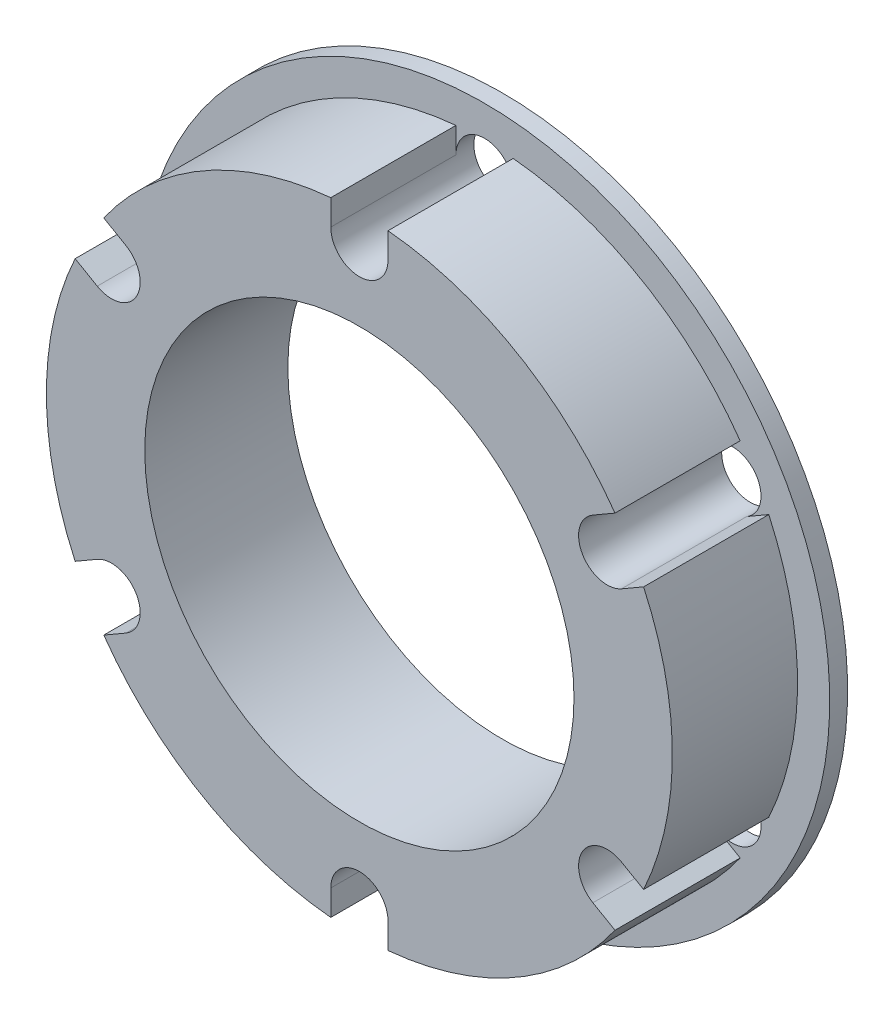
ISO-10303-21;
HEADER;
FILE_DESCRIPTION(('STEP AP214'),'2;1');
FILE_NAME('part.step','',(''),(''),'','','');
FILE_SCHEMA(('AUTOMOTIVE_DESIGN { 1 0 10303 214 1 1 1 1 }'));
ENDSEC;
DATA;
#1=APPLICATION_CONTEXT('core data for automotive mechanical design processes');
#2=APPLICATION_PROTOCOL_DEFINITION('international standard','automotive_design',2000,#1);
#3=PRODUCT_CONTEXT('',#1,'mechanical');
#4=PRODUCT('Part','Part','',(#3));
#5=PRODUCT_RELATED_PRODUCT_CATEGORY('part','',(#4));
#6=PRODUCT_DEFINITION_FORMATION('','',#4);
#7=PRODUCT_DEFINITION_CONTEXT('part definition',#1,'design');
#8=PRODUCT_DEFINITION('design','',#6,#7);
#9=PRODUCT_DEFINITION_SHAPE('','',#8);
#10=(LENGTH_UNIT() NAMED_UNIT(*) SI_UNIT(.MILLI.,.METRE.));
#11=(NAMED_UNIT(*) PLANE_ANGLE_UNIT() SI_UNIT($,.RADIAN.));
#12=(NAMED_UNIT(*) SI_UNIT($,.STERADIAN.) SOLID_ANGLE_UNIT());
#13=UNCERTAINTY_MEASURE_WITH_UNIT(LENGTH_MEASURE(1.E-05),#10,'distance_accuracy_value','');
#14=(GEOMETRIC_REPRESENTATION_CONTEXT(3) GLOBAL_UNCERTAINTY_ASSIGNED_CONTEXT((#13)) GLOBAL_UNIT_ASSIGNED_CONTEXT((#10,
#11,#12)) REPRESENTATION_CONTEXT('',''));
#15=CARTESIAN_POINT('',(0.,0.,0.));
#16=DIRECTION('',(0.,0.,1.));
#17=DIRECTION('',(1.,0.,0.));
#18=AXIS2_PLACEMENT_3D('',#15,#16,#17);
#19=CARTESIAN_POINT('',(0.,0.,-14.9097874185233));
#20=DIRECTION('',(0.,0.,-1.));
#21=DIRECTION('',(-1.,0.,0.));
#22=AXIS2_PLACEMENT_3D('',#19,#20,#21);
#23=CYLINDRICAL_SURFACE('',#22,17.5);
#24=DIRECTION('',(0.,0.,1.));
#25=VECTOR('',#24,1.);
#26=CARTESIAN_POINT('',(-1.6,17.4267036469896,-8.6865068641108));
#27=LINE('',#26,#25);
#28=CARTESIAN_POINT('',(-1.6,17.4267036469896,-3.5));
#29=VERTEX_POINT('',#28);
#30=CARTESIAN_POINT('',(-1.6,17.4267036469896,3.5));
#31=VERTEX_POINT('',#30);
#32=EDGE_CURVE('E220',#29,#31,#27,.T.);
#33=ORIENTED_EDGE('',*,*,#32,.F.);
#34=CARTESIAN_POINT('',(0.,0.,-3.5));
#35=DIRECTION('',(0.,0.,-1.));
#36=DIRECTION('',(-1.,0.,0.));
#37=AXIS2_PLACEMENT_3D('',#34,#35,#36);
#38=CIRCLE('',#37,17.5);
#39=CARTESIAN_POINT('',(-14.2919680625158,10.0989924695501,-3.5));
#40=VERTEX_POINT('',#39);
#41=EDGE_CURVE('E346',#40,#29,#38,.T.);
#42=ORIENTED_EDGE('',*,*,#41,.F.);
#43=DIRECTION('',(0.,0.,1.));
#44=VECTOR('',#43,1.);
#45=CARTESIAN_POINT('',(-14.2919680625158,10.0989924695501,-8.6865068641108));
#46=LINE('',#45,#44);
#47=CARTESIAN_POINT('',(-14.2919680625158,10.0989924695501,3.5));
#48=VERTEX_POINT('',#47);
#49=EDGE_CURVE('E241',#40,#48,#46,.T.);
#50=ORIENTED_EDGE('',*,*,#49,.T.);
#51=CARTESIAN_POINT('',(0.,0.,3.5));
#52=DIRECTION('',(0.,0.,-1.));
#53=DIRECTION('',(-1.,0.,0.));
#54=AXIS2_PLACEMENT_3D('',#51,#52,#53);
#55=CIRCLE('',#54,17.5);
#56=EDGE_CURVE('E341',#48,#31,#55,.T.);
#57=ORIENTED_EDGE('',*,*,#56,.T.);
#58=EDGE_LOOP('',(#33,#42,#50,#57));
#59=FACE_BOUND('',#58,.T.);
#60=ADVANCED_FACE('F33',(#59),#23,.T.);
#61=DIRECTION('',(0.,0.,1.));
#62=VECTOR('',#61,1.);
#63=CARTESIAN_POINT('',(-15.8919680625158,7.32771117743988,-8.6865068641108));
#64=LINE('',#63,#62);
#65=CARTESIAN_POINT('',(-15.8919680625158,7.32771117743988,-3.5));
#66=VERTEX_POINT('',#65);
#67=CARTESIAN_POINT('',(-15.8919680625158,7.32771117743988,3.5));
#68=VERTEX_POINT('',#67);
#69=EDGE_CURVE('E239',#66,#68,#64,.T.);
#70=ORIENTED_EDGE('',*,*,#69,.F.);
#71=CARTESIAN_POINT('',(-15.891968062516,-7.32771117743954,-3.5));
#72=VERTEX_POINT('',#71);
#73=EDGE_CURVE('E342',#72,#66,#38,.T.);
#74=ORIENTED_EDGE('',*,*,#73,.F.);
#75=DIRECTION('',(0.,0.,1.));
#76=VECTOR('',#75,1.);
#77=CARTESIAN_POINT('',(-15.891968062516,-7.32771117743954,-8.6865068641108));
#78=LINE('',#77,#76);
#79=CARTESIAN_POINT('',(-15.891968062516,-7.32771117743954,3.5));
#80=VERTEX_POINT('',#79);
#81=EDGE_CURVE('E328',#72,#80,#78,.T.);
#82=ORIENTED_EDGE('',*,*,#81,.T.);
#83=EDGE_CURVE('E337',#80,#68,#55,.T.);
#84=ORIENTED_EDGE('',*,*,#83,.T.);
#85=EDGE_LOOP('',(#70,#74,#82,#84));
#86=FACE_BOUND('',#85,.T.);
#87=ADVANCED_FACE('F367',(#86),#23,.T.);
#88=DIRECTION('',(0.,0.,1.));
#89=VECTOR('',#88,1.);
#90=CARTESIAN_POINT('',(-14.291968062516,-10.0989924695498,-8.6865068641108));
#91=LINE('',#90,#89);
#92=CARTESIAN_POINT('',(-14.291968062516,-10.0989924695498,-3.5));
#93=VERTEX_POINT('',#92);
#94=CARTESIAN_POINT('',(-14.291968062516,-10.0989924695498,3.5));
#95=VERTEX_POINT('',#94);
#96=EDGE_CURVE('E326',#93,#95,#91,.T.);
#97=ORIENTED_EDGE('',*,*,#96,.F.);
#98=CARTESIAN_POINT('',(-1.60000000000012,-17.4267036469896,-3.5));
#99=VERTEX_POINT('',#98);
#100=EDGE_CURVE('E345',#99,#93,#38,.T.);
#101=ORIENTED_EDGE('',*,*,#100,.F.);
#102=DIRECTION('',(0.,0.,1.));
#103=VECTOR('',#102,1.);
#104=CARTESIAN_POINT('',(-1.60000000000012,-17.4267036469896,-8.6865068641108));
#105=LINE('',#104,#103);
#106=CARTESIAN_POINT('',(-1.60000000000012,-17.4267036469896,3.5));
#107=VERTEX_POINT('',#106);
#108=EDGE_CURVE('E308',#99,#107,#105,.T.);
#109=ORIENTED_EDGE('',*,*,#108,.T.);
#110=EDGE_CURVE('E340',#107,#95,#55,.T.);
#111=ORIENTED_EDGE('',*,*,#110,.T.);
#112=EDGE_LOOP('',(#97,#101,#109,#111));
#113=FACE_BOUND('',#112,.T.);
#114=ADVANCED_FACE('F373',(#113),#23,.T.);
#115=DIRECTION('',(0.,0.,1.));
#116=VECTOR('',#115,1.);
#117=CARTESIAN_POINT('',(1.59999999999987,-17.4267036469896,-8.6865068641108));
#118=LINE('',#117,#116);
#119=CARTESIAN_POINT('',(1.59999999999987,-17.4267036469896,-3.5));
#120=VERTEX_POINT('',#119);
#121=CARTESIAN_POINT('',(1.59999999999987,-17.4267036469896,3.5));
#122=VERTEX_POINT('',#121);
#123=EDGE_CURVE('E306',#120,#122,#118,.T.);
#124=ORIENTED_EDGE('',*,*,#123,.F.);
#125=CARTESIAN_POINT('',(14.2919680625159,-10.09899246955,-3.5));
#126=VERTEX_POINT('',#125);
#127=EDGE_CURVE('E408',#126,#120,#38,.T.);
#128=ORIENTED_EDGE('',*,*,#127,.F.);
#129=DIRECTION('',(0.,0.,1.));
#130=VECTOR('',#129,1.);
#131=CARTESIAN_POINT('',(14.2919680625159,-10.09899246955,-8.6865068641108));
#132=LINE('',#131,#130);
#133=CARTESIAN_POINT('',(14.2919680625159,-10.09899246955,3.5));
#134=VERTEX_POINT('',#133);
#135=EDGE_CURVE('E286',#126,#134,#132,.T.);
#136=ORIENTED_EDGE('',*,*,#135,.T.);
#137=EDGE_CURVE('E755',#134,#122,#55,.T.);
#138=ORIENTED_EDGE('',*,*,#137,.T.);
#139=EDGE_LOOP('',(#124,#128,#136,#138));
#140=FACE_BOUND('',#139,.T.);
#141=ADVANCED_FACE('F387',(#140),#23,.T.);
#142=DIRECTION('',(0.,0.,1.));
#143=VECTOR('',#142,1.);
#144=CARTESIAN_POINT('',(15.8919680625159,-7.32771117743978,-8.6865068641108));
#145=LINE('',#144,#143);
#146=CARTESIAN_POINT('',(15.8919680625159,-7.32771117743977,-3.5));
#147=VERTEX_POINT('',#146);
#148=CARTESIAN_POINT('',(15.8919680625159,-7.32771117743978,3.5));
#149=VERTEX_POINT('',#148);
#150=EDGE_CURVE('E284',#147,#149,#145,.T.);
#151=ORIENTED_EDGE('',*,*,#150,.F.);
#152=CARTESIAN_POINT('',(15.8919680625159,7.32771117743966,-3.5));
#153=VERTEX_POINT('',#152);
#154=EDGE_CURVE('E399',#153,#147,#38,.T.);
#155=ORIENTED_EDGE('',*,*,#154,.F.);
#156=DIRECTION('',(0.,0.,1.));
#157=VECTOR('',#156,1.);
#158=CARTESIAN_POINT('',(15.8919680625159,7.32771117743966,-8.6865068641108));
#159=LINE('',#158,#157);
#160=CARTESIAN_POINT('',(15.8919680625159,7.32771117743966,3.5));
#161=VERTEX_POINT('',#160);
#162=EDGE_CURVE('E264',#153,#161,#159,.T.);
#163=ORIENTED_EDGE('',*,*,#162,.T.);
#164=EDGE_CURVE('E401',#161,#149,#55,.T.);
#165=ORIENTED_EDGE('',*,*,#164,.T.);
#166=EDGE_LOOP('',(#151,#155,#163,#165));
#167=FACE_BOUND('',#166,.T.);
#168=ADVANCED_FACE('F380',(#167),#23,.T.);
#169=CARTESIAN_POINT('',(0.,0.,-14.9097874185233));
#170=DIRECTION('',(0.,0.,-1.));
#171=DIRECTION('',(-1.,0.,0.));
#172=AXIS2_PLACEMENT_3D('',#169,#170,#171);
#173=CYLINDRICAL_SURFACE('',#172,12.);
#174=CARTESIAN_POINT('',(0.,0.,-4.5));
#175=DIRECTION('',(0.,0.,-1.));
#176=DIRECTION('',(-1.,0.,0.));
#177=AXIS2_PLACEMENT_3D('',#174,#175,#176);
#178=CIRCLE('',#177,12.);
#179=CARTESIAN_POINT('',(-12.,0.,-4.5));
#180=VERTEX_POINT('',#179);
#181=EDGE_CURVE('E11',#180,#180,#178,.T.);
#182=ORIENTED_EDGE('',*,*,#181,.T.);
#183=EDGE_LOOP('',(#182));
#184=FACE_BOUND('',#183,.T.);
#185=CARTESIAN_POINT('',(0.,0.,3.5));
#186=DIRECTION('',(0.,0.,-1.));
#187=DIRECTION('',(-1.,0.,0.));
#188=AXIS2_PLACEMENT_3D('',#185,#186,#187);
#189=CIRCLE('',#188,12.);
#190=CARTESIAN_POINT('',(-12.,0.,3.5));
#191=VERTEX_POINT('',#190);
#192=EDGE_CURVE('E214',#191,#191,#189,.T.);
#193=ORIENTED_EDGE('',*,*,#192,.F.);
#194=EDGE_LOOP('',(#193));
#195=FACE_BOUND('',#194,.T.);
#196=ADVANCED_FACE('F35',(#184,#195),#173,.F.);
#197=CARTESIAN_POINT('',(-12.,0.,-4.5));
#198=DIRECTION('',(0.,0.,-1.));
#199=DIRECTION('',(-1.,0.,0.));
#200=AXIS2_PLACEMENT_3D('',#197,#198,#199);
#201=PLANE('',#200);
#202=CARTESIAN_POINT('',(0.,16.,-4.5));
#203=DIRECTION('',(0.,0.,-1.));
#204=DIRECTION('',(-1.,0.,0.));
#205=AXIS2_PLACEMENT_3D('',#202,#203,#204);
#206=CIRCLE('',#205,1.6);
#207=CARTESIAN_POINT('',(-1.6,16.,-4.5));
#208=VERTEX_POINT('',#207);
#209=EDGE_CURVE('E206',#208,#208,#206,.T.);
#210=ORIENTED_EDGE('',*,*,#209,.F.);
#211=EDGE_LOOP('',(#210));
#212=FACE_BOUND('',#211,.T.);
#213=CARTESIAN_POINT('',(13.8564064605505,7.99999999999901,-4.5));
#214=DIRECTION('',(0.,0.,-1.));
#215=DIRECTION('',(-1.,0.,0.));
#216=AXIS2_PLACEMENT_3D('',#213,#214,#215);
#217=CIRCLE('',#216,1.60000000000102);
#218=CARTESIAN_POINT('',(12.2564064605494,7.99999999999901,-4.5));
#219=VERTEX_POINT('',#218);
#220=EDGE_CURVE('E498',#219,#219,#217,.T.);
#221=ORIENTED_EDGE('',*,*,#220,.F.);
#222=EDGE_LOOP('',(#221));
#223=FACE_BOUND('',#222,.T.);
#224=CARTESIAN_POINT('',(13.8564064605493,-8.00000000000099,-4.5));
#225=DIRECTION('',(0.,0.,-1.));
#226=DIRECTION('',(-1.,0.,0.));
#227=AXIS2_PLACEMENT_3D('',#224,#225,#226);
#228=CIRCLE('',#227,1.60000000000206);
#229=CARTESIAN_POINT('',(12.2564064605473,-8.00000000000099,-4.5));
#230=VERTEX_POINT('',#229);
#231=EDGE_CURVE('E474',#230,#230,#228,.T.);
#232=ORIENTED_EDGE('',*,*,#231,.F.);
#233=EDGE_LOOP('',(#232));
#234=FACE_BOUND('',#233,.T.);
#235=CARTESIAN_POINT('',(-2.26785844979641E-12,-16.,-4.5));
#236=DIRECTION('',(0.,0.,-1.));
#237=DIRECTION('',(-1.,0.,0.));
#238=AXIS2_PLACEMENT_3D('',#235,#236,#237);
#239=CIRCLE('',#238,1.60000000000228);
#240=CARTESIAN_POINT('',(-1.60000000000454,-16.,-4.5));
#241=VERTEX_POINT('',#240);
#242=EDGE_CURVE('E469',#241,#241,#239,.T.);
#243=ORIENTED_EDGE('',*,*,#242,.F.);
#244=EDGE_LOOP('',(#243));
#245=FACE_BOUND('',#244,.T.);
#246=CARTESIAN_POINT('',(-13.8564064605527,-7.99999999999902,-4.5));
#247=DIRECTION('',(0.,0.,-1.));
#248=DIRECTION('',(-1.,0.,0.));
#249=AXIS2_PLACEMENT_3D('',#246,#247,#248);
#250=CIRCLE('',#249,1.60000000000142);
#251=CARTESIAN_POINT('',(-15.4564064605541,-7.99999999999902,-4.5));
#252=VERTEX_POINT('',#251);
#253=EDGE_CURVE('E464',#252,#252,#250,.T.);
#254=ORIENTED_EDGE('',*,*,#253,.F.);
#255=EDGE_LOOP('',(#254));
#256=FACE_BOUND('',#255,.T.);
#257=CARTESIAN_POINT('',(-13.8564064605516,8.00000000000099,-4.5));
#258=DIRECTION('',(0.,0.,-1.));
#259=DIRECTION('',(-1.,0.,0.));
#260=AXIS2_PLACEMENT_3D('',#257,#258,#259);
#261=CIRCLE('',#260,1.6000000000003);
#262=CARTESIAN_POINT('',(-15.4564064605519,8.00000000000099,-4.5));
#263=VERTEX_POINT('',#262);
#264=EDGE_CURVE('E456',#263,#263,#261,.T.);
#265=ORIENTED_EDGE('',*,*,#264,.F.);
#266=EDGE_LOOP('',(#265));
#267=FACE_BOUND('',#266,.T.);
#268=CARTESIAN_POINT('',(0.,0.,-4.5));
#269=DIRECTION('',(0.,0.,-1.));
#270=DIRECTION('',(-1.,0.,0.));
#271=AXIS2_PLACEMENT_3D('',#268,#269,#270);
#272=CIRCLE('',#271,19.3);
#273=CARTESIAN_POINT('',(-19.3,0.,-4.5));
#274=VERTEX_POINT('',#273);
#275=EDGE_CURVE('E41',#274,#274,#272,.T.);
#276=ORIENTED_EDGE('',*,*,#275,.T.);
#277=EDGE_LOOP('',(#276));
#278=FACE_BOUND('',#277,.T.);
#279=ORIENTED_EDGE('',*,*,#181,.F.);
#280=EDGE_LOOP('',(#279));
#281=FACE_BOUND('',#280,.T.);
#282=ADVANCED_FACE('F352',(#212,#223,#234,#245,#256,#267,#278,#281),#201,.T.);
#283=CARTESIAN_POINT('',(0.,0.,-14.9097874185233));
#284=DIRECTION('',(0.,0.,-1.));
#285=DIRECTION('',(-1.,0.,0.));
#286=AXIS2_PLACEMENT_3D('',#283,#284,#285);
#287=CYLINDRICAL_SURFACE('',#286,19.3);
#288=CARTESIAN_POINT('',(0.,0.,-3.5));
#289=DIRECTION('',(0.,0.,-1.));
#290=DIRECTION('',(-1.,0.,0.));
#291=AXIS2_PLACEMENT_3D('',#288,#289,#290);
#292=CIRCLE('',#291,19.3);
#293=CARTESIAN_POINT('',(-19.3,0.,-3.5));
#294=VERTEX_POINT('',#293);
#295=EDGE_CURVE('E347',#294,#294,#292,.T.);
#296=ORIENTED_EDGE('',*,*,#295,.T.);
#297=EDGE_LOOP('',(#296));
#298=FACE_BOUND('',#297,.T.);
#299=ORIENTED_EDGE('',*,*,#275,.F.);
#300=EDGE_LOOP('',(#299));
#301=FACE_BOUND('',#300,.T.);
#302=ADVANCED_FACE('F355',(#298,#301),#287,.T.);
#303=CARTESIAN_POINT('',(-19.3,0.,-3.5));
#304=DIRECTION('',(0.,0.,1.));
#305=DIRECTION('',(1.,0.,0.));
#306=AXIS2_PLACEMENT_3D('',#303,#304,#305);
#307=PLANE('',#306);
#308=CARTESIAN_POINT('',(0.,16.,-3.5));
#309=DIRECTION('',(0.,0.,1.));
#310=DIRECTION('',(1.,0.,0.));
#311=AXIS2_PLACEMENT_3D('',#308,#309,#310);
#312=CIRCLE('',#311,1.6);
#313=CARTESIAN_POINT('',(-1.6,16.,-3.5));
#314=VERTEX_POINT('',#313);
#315=CARTESIAN_POINT('',(1.6,16.,-3.5));
#316=VERTEX_POINT('',#315);
#317=EDGE_CURVE('E196',#314,#316,#312,.F.);
#318=ORIENTED_EDGE('',*,*,#317,.T.);
#319=DIRECTION('',(0.,-1.,0.));
#320=VECTOR('',#319,1.);
#321=CARTESIAN_POINT('',(1.6,16.,-3.5));
#322=LINE('',#321,#320);
#323=CARTESIAN_POINT('',(1.6,17.4267036469896,-3.5));
#324=VERTEX_POINT('',#323);
#325=EDGE_CURVE('E201',#324,#316,#322,.T.);
#326=ORIENTED_EDGE('',*,*,#325,.F.);
#327=CARTESIAN_POINT('',(14.2919680625159,10.0989924695499,-3.5));
#328=VERTEX_POINT('',#327);
#329=EDGE_CURVE('E407',#324,#328,#38,.T.);
#330=ORIENTED_EDGE('',*,*,#329,.T.);
#331=DIRECTION('',(0.86602540378444,0.499999999999998,0.));
#332=VECTOR('',#331,1.);
#333=CARTESIAN_POINT('',(13.056406460551,9.38564064605507,-3.5));
#334=LINE('',#333,#332);
#335=CARTESIAN_POINT('',(13.056406460551,9.38564064605507,-3.5));
#336=VERTEX_POINT('',#335);
#337=EDGE_CURVE('E248',#336,#328,#334,.T.);
#338=ORIENTED_EDGE('',*,*,#337,.F.);
#339=CARTESIAN_POINT('',(13.8564064605505,7.99999999999901,-3.5));
#340=DIRECTION('',(0.,0.,1.));
#341=DIRECTION('',(1.,0.,0.));
#342=AXIS2_PLACEMENT_3D('',#339,#340,#341);
#343=CIRCLE('',#342,1.60000000000102);
#344=CARTESIAN_POINT('',(14.6564064605502,6.61435935394437,-3.5));
#345=VERTEX_POINT('',#344);
#346=EDGE_CURVE('E477',#336,#345,#343,.F.);
#347=ORIENTED_EDGE('',*,*,#346,.T.);
#348=DIRECTION('',(-0.86602540378444,-0.499999999999998,0.));
#349=VECTOR('',#348,1.);
#350=CARTESIAN_POINT('',(14.656406460551,6.61435935394486,-3.5));
#351=LINE('',#350,#349);
#352=EDGE_CURVE('E250',#153,#345,#351,.T.);
#353=ORIENTED_EDGE('',*,*,#352,.F.);
#354=ORIENTED_EDGE('',*,*,#154,.T.);
#355=DIRECTION('',(0.866025403784436,-0.500000000000004,0.));
#356=VECTOR('',#355,1.);
#357=CARTESIAN_POINT('',(14.656406460551,-6.61435935394497,-3.5));
#358=LINE('',#357,#356);
#359=CARTESIAN_POINT('',(14.656406460551,-6.61435935394497,-3.5));
#360=VERTEX_POINT('',#359);
#361=EDGE_CURVE('E271',#360,#147,#358,.T.);
#362=ORIENTED_EDGE('',*,*,#361,.F.);
#363=CARTESIAN_POINT('',(13.8564064605493,-8.00000000000099,-3.5));
#364=DIRECTION('',(0.,0.,1.));
#365=DIRECTION('',(1.,0.,0.));
#366=AXIS2_PLACEMENT_3D('',#363,#364,#365);
#367=CIRCLE('',#366,1.60000000000206);
#368=CARTESIAN_POINT('',(13.0564064605501,-9.38564064605467,-3.5));
#369=VERTEX_POINT('',#368);
#370=EDGE_CURVE('E472',#360,#369,#367,.F.);
#371=ORIENTED_EDGE('',*,*,#370,.T.);
#372=DIRECTION('',(-0.866025403784436,0.500000000000004,0.));
#373=VECTOR('',#372,1.);
#374=CARTESIAN_POINT('',(13.056406460551,-9.38564064605517,-3.5));
#375=LINE('',#374,#373);
#376=EDGE_CURVE('E255',#126,#369,#375,.T.);
#377=ORIENTED_EDGE('',*,*,#376,.F.);
#378=ORIENTED_EDGE('',*,*,#127,.T.);
#379=DIRECTION('',(0.,-1.,0.));
#380=VECTOR('',#379,1.);
#381=CARTESIAN_POINT('',(1.59999999999989,-16.,-3.5));
#382=LINE('',#381,#380);
#383=CARTESIAN_POINT('',(1.59999999999989,-16.,-3.5));
#384=VERTEX_POINT('',#383);
#385=EDGE_CURVE('E293',#384,#120,#382,.T.);
#386=ORIENTED_EDGE('',*,*,#385,.F.);
#387=CARTESIAN_POINT('',(-2.26785844979641E-12,-16.,-3.5));
#388=DIRECTION('',(0.,0.,1.));
#389=DIRECTION('',(1.,0.,0.));
#390=AXIS2_PLACEMENT_3D('',#387,#388,#389);
#391=CIRCLE('',#390,1.60000000000228);
#392=CARTESIAN_POINT('',(-1.60000000000011,-16.,-3.5));
#393=VERTEX_POINT('',#392);
#394=EDGE_CURVE('E467',#384,#393,#391,.F.);
#395=ORIENTED_EDGE('',*,*,#394,.T.);
#396=DIRECTION('',(0.,1.,0.));
#397=VECTOR('',#396,1.);
#398=CARTESIAN_POINT('',(-1.60000000000011,-16.,-3.5));
#399=LINE('',#398,#397);
#400=EDGE_CURVE('E277',#99,#393,#399,.T.);
#401=ORIENTED_EDGE('',*,*,#400,.F.);
#402=ORIENTED_EDGE('',*,*,#100,.T.);
#403=DIRECTION('',(-0.866025403784444,-0.499999999999992,0.));
#404=VECTOR('',#403,1.);
#405=CARTESIAN_POINT('',(-13.0564064605511,-9.38564064605498,-3.5));
#406=LINE('',#405,#404);
#407=CARTESIAN_POINT('',(-13.0564064605511,-9.38564064605498,-3.5));
#408=VERTEX_POINT('',#407);
#409=EDGE_CURVE('E315',#408,#93,#406,.T.);
#410=ORIENTED_EDGE('',*,*,#409,.F.);
#411=CARTESIAN_POINT('',(-13.8564064605527,-7.99999999999902,-3.5));
#412=DIRECTION('',(0.,0.,1.));
#413=DIRECTION('',(1.,0.,0.));
#414=AXIS2_PLACEMENT_3D('',#411,#412,#413);
#415=CIRCLE('',#414,1.60000000000142);
#416=CARTESIAN_POINT('',(-14.6564064605519,-6.61435935394525,-3.5));
#417=VERTEX_POINT('',#416);
#418=EDGE_CURVE('E440',#408,#417,#415,.F.);
#419=ORIENTED_EDGE('',*,*,#418,.T.);
#420=DIRECTION('',(0.866025403784444,0.499999999999992,0.));
#421=VECTOR('',#420,1.);
#422=CARTESIAN_POINT('',(-14.6564064605511,-6.61435935394476,-3.5));
#423=LINE('',#422,#421);
#424=EDGE_CURVE('E299',#72,#417,#423,.T.);
#425=ORIENTED_EDGE('',*,*,#424,.F.);
#426=ORIENTED_EDGE('',*,*,#73,.T.);
#427=DIRECTION('',(-0.866025403784433,0.50000000000001,0.));
#428=VECTOR('',#427,1.);
#429=CARTESIAN_POINT('',(-14.6564064605509,6.61435935394507,-3.5));
#430=LINE('',#429,#428);
#431=CARTESIAN_POINT('',(-14.6564064605509,6.61435935394507,-3.5));
#432=VERTEX_POINT('',#431);
#433=EDGE_CURVE('E227',#432,#66,#430,.T.);
#434=ORIENTED_EDGE('',*,*,#433,.F.);
#435=CARTESIAN_POINT('',(-13.8564064605516,8.00000000000099,-3.5));
#436=DIRECTION('',(0.,0.,1.));
#437=DIRECTION('',(1.,0.,0.));
#438=AXIS2_PLACEMENT_3D('',#435,#436,#437);
#439=CIRCLE('',#438,1.6000000000003);
#440=CARTESIAN_POINT('',(-13.0564064605518,9.38564064605574,-3.5));
#441=VERTEX_POINT('',#440);
#442=EDGE_CURVE('E453',#432,#441,#439,.F.);
#443=ORIENTED_EDGE('',*,*,#442,.T.);
#444=DIRECTION('',(0.866025403784433,-0.50000000000001,0.));
#445=VECTOR('',#444,1.);
#446=CARTESIAN_POINT('',(-13.0564064605509,9.38564064605525,-3.5));
#447=LINE('',#446,#445);
#448=EDGE_CURVE('E229',#40,#441,#447,.T.);
#449=ORIENTED_EDGE('',*,*,#448,.F.);
#450=ORIENTED_EDGE('',*,*,#41,.T.);
#451=DIRECTION('',(0.,1.,0.));
#452=VECTOR('',#451,1.);
#453=CARTESIAN_POINT('',(-1.6,16.,-3.5));
#454=LINE('',#453,#452);
#455=EDGE_CURVE('E204',#314,#29,#454,.T.);
#456=ORIENTED_EDGE('',*,*,#455,.F.);
#457=EDGE_LOOP('',(#318,#326,#330,#338,#347,#353,#354,#362,#371,#377,#378,#386,#395,#401,#402,
#410,#419,#425,#426,#434,#443,#449,#450,#456));
#458=FACE_BOUND('',#457,.T.);
#459=ORIENTED_EDGE('',*,*,#295,.F.);
#460=EDGE_LOOP('',(#459));
#461=FACE_BOUND('',#460,.T.);
#462=ADVANCED_FACE('F198',(#458,#461),#307,.T.);
#463=DIRECTION('',(0.,0.,1.));
#464=VECTOR('',#463,1.);
#465=CARTESIAN_POINT('',(1.6,17.4267036469896,-8.6865068641108));
#466=LINE('',#465,#464);
#467=CARTESIAN_POINT('',(1.6,17.4267036469896,3.5));
#468=VERTEX_POINT('',#467);
#469=EDGE_CURVE('E213',#324,#468,#466,.T.);
#470=ORIENTED_EDGE('',*,*,#469,.T.);
#471=CARTESIAN_POINT('',(14.2919680625159,10.0989924695499,3.5));
#472=VERTEX_POINT('',#471);
#473=EDGE_CURVE('E488',#468,#472,#55,.T.);
#474=ORIENTED_EDGE('',*,*,#473,.T.);
#475=DIRECTION('',(0.,0.,1.));
#476=VECTOR('',#475,1.);
#477=CARTESIAN_POINT('',(14.2919680625159,10.0989924695499,-8.6865068641108));
#478=LINE('',#477,#476);
#479=EDGE_CURVE('E262',#328,#472,#478,.T.);
#480=ORIENTED_EDGE('',*,*,#479,.F.);
#481=ORIENTED_EDGE('',*,*,#329,.F.);
#482=EDGE_LOOP('',(#470,#474,#480,#481));
#483=FACE_BOUND('',#482,.T.);
#484=ADVANCED_FACE('F363',(#483),#23,.T.);
#485=CARTESIAN_POINT('',(-17.5,0.,3.5));
#486=DIRECTION('',(0.,0.,1.));
#487=DIRECTION('',(1.,0.,0.));
#488=AXIS2_PLACEMENT_3D('',#485,#486,#487);
#489=PLANE('',#488);
#490=DIRECTION('',(0.,-1.,0.));
#491=VECTOR('',#490,1.);
#492=CARTESIAN_POINT('',(-1.6,16.,3.5));
#493=LINE('',#492,#491);
#494=CARTESIAN_POINT('',(-1.6,16.,3.5));
#495=VERTEX_POINT('',#494);
#496=EDGE_CURVE('E218',#31,#495,#493,.T.);
#497=ORIENTED_EDGE('',*,*,#496,.F.);
#498=ORIENTED_EDGE('',*,*,#56,.F.);
#499=DIRECTION('',(-0.866025403784433,0.50000000000001,0.));
#500=VECTOR('',#499,1.);
#501=CARTESIAN_POINT('',(-13.0564064605509,9.38564064605525,3.5));
#502=LINE('',#501,#500);
#503=CARTESIAN_POINT('',(-13.0564064605509,9.38564064605525,3.5));
#504=VERTEX_POINT('',#503);
#505=EDGE_CURVE('E232',#504,#48,#502,.T.);
#506=ORIENTED_EDGE('',*,*,#505,.F.);
#507=CARTESIAN_POINT('',(-13.8564064605509,8.00000000000016,3.5));
#508=DIRECTION('',(0.,0.,1.));
#509=DIRECTION('',(1.,0.,0.));
#510=AXIS2_PLACEMENT_3D('',#507,#508,#509);
#511=CIRCLE('',#510,1.6);
#512=CARTESIAN_POINT('',(-14.6564064605509,6.61435935394507,3.5));
#513=VERTEX_POINT('',#512);
#514=EDGE_CURVE('E56',#513,#504,#511,.T.);
#515=ORIENTED_EDGE('',*,*,#514,.F.);
#516=DIRECTION('',(0.866025403784433,-0.50000000000001,0.));
#517=VECTOR('',#516,1.);
#518=CARTESIAN_POINT('',(-14.6564064605509,6.61435935394507,3.5));
#519=LINE('',#518,#517);
#520=EDGE_CURVE('E234',#68,#513,#519,.T.);
#521=ORIENTED_EDGE('',*,*,#520,.F.);
#522=ORIENTED_EDGE('',*,*,#83,.F.);
#523=DIRECTION('',(-0.866025403784444,-0.499999999999992,0.));
#524=VECTOR('',#523,1.);
#525=CARTESIAN_POINT('',(-14.6564064605511,-6.61435935394476,3.5));
#526=LINE('',#525,#524);
#527=CARTESIAN_POINT('',(-14.6564064605511,-6.61435935394476,3.5));
#528=VERTEX_POINT('',#527);
#529=EDGE_CURVE('E319',#528,#80,#526,.T.);
#530=ORIENTED_EDGE('',*,*,#529,.F.);
#531=CARTESIAN_POINT('',(-13.8564064605511,-7.99999999999987,3.5));
#532=DIRECTION('',(0.,0.,1.));
#533=DIRECTION('',(1.,0.,0.));
#534=AXIS2_PLACEMENT_3D('',#531,#532,#533);
#535=CIRCLE('',#534,1.6);
#536=CARTESIAN_POINT('',(-13.0564064605511,-9.38564064605498,3.5));
#537=VERTEX_POINT('',#536);
#538=EDGE_CURVE('E247',#537,#528,#535,.T.);
#539=ORIENTED_EDGE('',*,*,#538,.F.);
#540=DIRECTION('',(0.866025403784444,0.499999999999992,0.));
#541=VECTOR('',#540,1.);
#542=CARTESIAN_POINT('',(-13.0564064605511,-9.38564064605498,3.5));
#543=LINE('',#542,#541);
#544=EDGE_CURVE('E321',#95,#537,#543,.T.);
#545=ORIENTED_EDGE('',*,*,#544,.F.);
#546=ORIENTED_EDGE('',*,*,#110,.F.);
#547=DIRECTION('',(0.,-1.,0.));
#548=VECTOR('',#547,1.);
#549=CARTESIAN_POINT('',(-1.60000000000011,-16.,3.5));
#550=LINE('',#549,#548);
#551=CARTESIAN_POINT('',(-1.60000000000011,-16.,3.5));
#552=VERTEX_POINT('',#551);
#553=EDGE_CURVE('E298',#552,#107,#550,.T.);
#554=ORIENTED_EDGE('',*,*,#553,.F.);
#555=CARTESIAN_POINT('',(-1.1172740284298E-13,-16.,3.5));
#556=DIRECTION('',(0.,0.,1.));
#557=DIRECTION('',(1.,0.,0.));
#558=AXIS2_PLACEMENT_3D('',#555,#556,#557);
#559=CIRCLE('',#558,1.6);
#560=CARTESIAN_POINT('',(1.59999999999989,-16.,3.5));
#561=VERTEX_POINT('',#560);
#562=EDGE_CURVE('E296',#561,#552,#559,.T.);
#563=ORIENTED_EDGE('',*,*,#562,.F.);
#564=DIRECTION('',(0.,1.,0.));
#565=VECTOR('',#564,1.);
#566=CARTESIAN_POINT('',(1.59999999999989,-16.,3.5));
#567=LINE('',#566,#565);
#568=EDGE_CURVE('E301',#122,#561,#567,.T.);
#569=ORIENTED_EDGE('',*,*,#568,.F.);
#570=ORIENTED_EDGE('',*,*,#137,.F.);
#571=DIRECTION('',(0.866025403784436,-0.500000000000004,0.));
#572=VECTOR('',#571,1.);
#573=CARTESIAN_POINT('',(13.056406460551,-9.38564064605517,3.5));
#574=LINE('',#573,#572);
#575=CARTESIAN_POINT('',(13.056406460551,-9.38564064605517,3.5));
#576=VERTEX_POINT('',#575);
#577=EDGE_CURVE('E276',#576,#134,#574,.T.);
#578=ORIENTED_EDGE('',*,*,#577,.F.);
#579=CARTESIAN_POINT('',(13.856406460551,-8.00000000000007,3.5));
#580=DIRECTION('',(0.,0.,1.));
#581=DIRECTION('',(1.,0.,0.));
#582=AXIS2_PLACEMENT_3D('',#579,#580,#581);
#583=CIRCLE('',#582,1.6);
#584=CARTESIAN_POINT('',(14.656406460551,-6.61435935394497,3.5));
#585=VERTEX_POINT('',#584);
#586=EDGE_CURVE('E274',#585,#576,#583,.T.);
#587=ORIENTED_EDGE('',*,*,#586,.F.);
#588=DIRECTION('',(-0.866025403784436,0.500000000000004,0.));
#589=VECTOR('',#588,1.);
#590=CARTESIAN_POINT('',(14.656406460551,-6.61435935394497,3.5));
#591=LINE('',#590,#589);
#592=EDGE_CURVE('E279',#149,#585,#591,.T.);
#593=ORIENTED_EDGE('',*,*,#592,.F.);
#594=ORIENTED_EDGE('',*,*,#164,.F.);
#595=DIRECTION('',(0.86602540378444,0.499999999999998,0.));
#596=VECTOR('',#595,1.);
#597=CARTESIAN_POINT('',(14.656406460551,6.61435935394486,3.5));
#598=LINE('',#597,#596);
#599=CARTESIAN_POINT('',(14.656406460551,6.61435935394486,3.5));
#600=VERTEX_POINT('',#599);
#601=EDGE_CURVE('E254',#600,#161,#598,.T.);
#602=ORIENTED_EDGE('',*,*,#601,.F.);
#603=CARTESIAN_POINT('',(13.856406460551,7.99999999999997,3.5));
#604=DIRECTION('',(0.,0.,1.));
#605=DIRECTION('',(1.,0.,0.));
#606=AXIS2_PLACEMENT_3D('',#603,#604,#605);
#607=CIRCLE('',#606,1.6);
#608=CARTESIAN_POINT('',(13.056406460551,9.38564064605507,3.5));
#609=VERTEX_POINT('',#608);
#610=EDGE_CURVE('E252',#609,#600,#607,.T.);
#611=ORIENTED_EDGE('',*,*,#610,.F.);
#612=DIRECTION('',(-0.86602540378444,-0.499999999999998,0.));
#613=VECTOR('',#612,1.);
#614=CARTESIAN_POINT('',(13.056406460551,9.38564064605507,3.5));
#615=LINE('',#614,#613);
#616=EDGE_CURVE('E257',#472,#609,#615,.T.);
#617=ORIENTED_EDGE('',*,*,#616,.F.);
#618=ORIENTED_EDGE('',*,*,#473,.F.);
#619=DIRECTION('',(0.,1.,0.));
#620=VECTOR('',#619,1.);
#621=CARTESIAN_POINT('',(1.6,16.,3.5));
#622=LINE('',#621,#620);
#623=CARTESIAN_POINT('',(1.6,16.,3.5));
#624=VERTEX_POINT('',#623);
#625=EDGE_CURVE('E223',#624,#468,#622,.T.);
#626=ORIENTED_EDGE('',*,*,#625,.F.);
#627=CARTESIAN_POINT('',(0.,16.,3.5));
#628=DIRECTION('',(0.,0.,1.));
#629=DIRECTION('',(1.,0.,0.));
#630=AXIS2_PLACEMENT_3D('',#627,#628,#629);
#631=CIRCLE('',#630,1.6);
#632=EDGE_CURVE('E48',#495,#624,#631,.T.);
#633=ORIENTED_EDGE('',*,*,#632,.F.);
#634=EDGE_LOOP('',(#497,#498,#506,#515,#521,#522,#530,#539,#545,#546,#554,#563,#569,#570,#578,
#587,#593,#594,#602,#611,#617,#618,#626,#633));
#635=FACE_BOUND('',#634,.T.);
#636=ORIENTED_EDGE('',*,*,#192,.T.);
#637=EDGE_LOOP('',(#636));
#638=FACE_BOUND('',#637,.T.);
#639=ADVANCED_FACE('F378',(#635,#638),#489,.T.);
#640=CARTESIAN_POINT('',(13.856406460551,7.99999999999997,-8.6865068641108));
#641=DIRECTION('',(0.,0.,1.));
#642=DIRECTION('',(1.,0.,0.));
#643=AXIS2_PLACEMENT_3D('',#640,#641,#642);
#644=CYLINDRICAL_SURFACE('',#643,1.6);
#645=DIRECTION('',(0.,0.,1.));
#646=VECTOR('',#645,1.);
#647=CARTESIAN_POINT('',(14.656406460551,6.61435935394486,-8.6865068641108));
#648=LINE('',#647,#646);
#649=EDGE_CURVE('E260',#345,#600,#648,.T.);
#650=ORIENTED_EDGE('',*,*,#649,.F.);
#651=ORIENTED_EDGE('',*,*,#346,.F.);
#652=DIRECTION('',(0.,0.,1.));
#653=VECTOR('',#652,1.);
#654=CARTESIAN_POINT('',(13.056406460551,9.38564064605507,-8.6865068641108));
#655=LINE('',#654,#653);
#656=EDGE_CURVE('E251',#336,#609,#655,.T.);
#657=ORIENTED_EDGE('',*,*,#656,.T.);
#658=ORIENTED_EDGE('',*,*,#610,.T.);
#659=EDGE_LOOP('',(#650,#651,#657,#658));
#660=FACE_BOUND('',#659,.T.);
#661=ORIENTED_EDGE('',*,*,#220,.T.);
#662=EDGE_LOOP('',(#661));
#663=FACE_BOUND('',#662,.T.);
#664=ADVANCED_FACE('F384',(#660,#663),#644,.F.);
#665=CARTESIAN_POINT('',(13.056406460551,9.38564064605507,-8.6865068641108));
#666=DIRECTION('',(-0.499999999999998,0.86602540378444,0.));
#667=DIRECTION('',(-0.86602540378444,-0.499999999999998,0.));
#668=AXIS2_PLACEMENT_3D('',#665,#666,#667);
#669=PLANE('',#668);
#670=ORIENTED_EDGE('',*,*,#337,.T.);
#671=ORIENTED_EDGE('',*,*,#479,.T.);
#672=ORIENTED_EDGE('',*,*,#616,.T.);
#673=ORIENTED_EDGE('',*,*,#656,.F.);
#674=EDGE_LOOP('',(#670,#671,#672,#673));
#675=FACE_BOUND('',#674,.T.);
#676=ADVANCED_FACE('F493',(#675),#669,.F.);
#677=CARTESIAN_POINT('',(14.656406460551,6.61435935394486,-8.6865068641108));
#678=DIRECTION('',(0.499999999999998,-0.86602540378444,0.));
#679=DIRECTION('',(0.86602540378444,0.499999999999998,0.));
#680=AXIS2_PLACEMENT_3D('',#677,#678,#679);
#681=PLANE('',#680);
#682=ORIENTED_EDGE('',*,*,#352,.T.);
#683=ORIENTED_EDGE('',*,*,#649,.T.);
#684=ORIENTED_EDGE('',*,*,#601,.T.);
#685=ORIENTED_EDGE('',*,*,#162,.F.);
#686=EDGE_LOOP('',(#682,#683,#684,#685));
#687=FACE_BOUND('',#686,.T.);
#688=ADVANCED_FACE('F523',(#687),#681,.F.);
#689=CARTESIAN_POINT('',(13.856406460551,-8.00000000000007,-8.6865068641108));
#690=DIRECTION('',(0.,0.,1.));
#691=DIRECTION('',(1.,0.,0.));
#692=AXIS2_PLACEMENT_3D('',#689,#690,#691);
#693=CYLINDRICAL_SURFACE('',#692,1.6);
#694=DIRECTION('',(0.,0.,1.));
#695=VECTOR('',#694,1.);
#696=CARTESIAN_POINT('',(13.056406460551,-9.38564064605517,-8.6865068641108));
#697=LINE('',#696,#695);
#698=EDGE_CURVE('E282',#369,#576,#697,.T.);
#699=ORIENTED_EDGE('',*,*,#698,.F.);
#700=ORIENTED_EDGE('',*,*,#370,.F.);
#701=DIRECTION('',(0.,0.,1.));
#702=VECTOR('',#701,1.);
#703=CARTESIAN_POINT('',(14.656406460551,-6.61435935394497,-8.6865068641108));
#704=LINE('',#703,#702);
#705=EDGE_CURVE('E273',#360,#585,#704,.T.);
#706=ORIENTED_EDGE('',*,*,#705,.T.);
#707=ORIENTED_EDGE('',*,*,#586,.T.);
#708=EDGE_LOOP('',(#699,#700,#706,#707));
#709=FACE_BOUND('',#708,.T.);
#710=ORIENTED_EDGE('',*,*,#231,.T.);
#711=EDGE_LOOP('',(#710));
#712=FACE_BOUND('',#711,.T.);
#713=ADVANCED_FACE('F526',(#709,#712),#693,.F.);
#714=CARTESIAN_POINT('',(14.656406460551,-6.61435935394497,-8.6865068641108));
#715=DIRECTION('',(0.500000000000004,0.866025403784436,0.));
#716=DIRECTION('',(-0.866025403784436,0.500000000000004,0.));
#717=AXIS2_PLACEMENT_3D('',#714,#715,#716);
#718=PLANE('',#717);
#719=ORIENTED_EDGE('',*,*,#361,.T.);
#720=ORIENTED_EDGE('',*,*,#150,.T.);
#721=ORIENTED_EDGE('',*,*,#592,.T.);
#722=ORIENTED_EDGE('',*,*,#705,.F.);
#723=EDGE_LOOP('',(#719,#720,#721,#722));
#724=FACE_BOUND('',#723,.T.);
#725=ADVANCED_FACE('F530',(#724),#718,.F.);
#726=CARTESIAN_POINT('',(13.056406460551,-9.38564064605517,-8.6865068641108));
#727=DIRECTION('',(-0.500000000000004,-0.866025403784436,0.));
#728=DIRECTION('',(0.866025403784436,-0.500000000000004,0.));
#729=AXIS2_PLACEMENT_3D('',#726,#727,#728);
#730=PLANE('',#729);
#731=ORIENTED_EDGE('',*,*,#376,.T.);
#732=ORIENTED_EDGE('',*,*,#698,.T.);
#733=ORIENTED_EDGE('',*,*,#577,.T.);
#734=ORIENTED_EDGE('',*,*,#135,.F.);
#735=EDGE_LOOP('',(#731,#732,#733,#734));
#736=FACE_BOUND('',#735,.T.);
#737=ADVANCED_FACE('F533',(#736),#730,.F.);
#738=CARTESIAN_POINT('',(-1.1172740284298E-13,-16.,-8.6865068641108));
#739=DIRECTION('',(0.,0.,1.));
#740=DIRECTION('',(1.,0.,0.));
#741=AXIS2_PLACEMENT_3D('',#738,#739,#740);
#742=CYLINDRICAL_SURFACE('',#741,1.6);
#743=DIRECTION('',(0.,0.,1.));
#744=VECTOR('',#743,1.);
#745=CARTESIAN_POINT('',(-1.60000000000011,-16.,-8.6865068641108));
#746=LINE('',#745,#744);
#747=EDGE_CURVE('E304',#393,#552,#746,.T.);
#748=ORIENTED_EDGE('',*,*,#747,.F.);
#749=ORIENTED_EDGE('',*,*,#394,.F.);
#750=DIRECTION('',(0.,0.,1.));
#751=VECTOR('',#750,1.);
#752=CARTESIAN_POINT('',(1.59999999999989,-16.,-8.6865068641108));
#753=LINE('',#752,#751);
#754=EDGE_CURVE('E295',#384,#561,#753,.T.);
#755=ORIENTED_EDGE('',*,*,#754,.T.);
#756=ORIENTED_EDGE('',*,*,#562,.T.);
#757=EDGE_LOOP('',(#748,#749,#755,#756));
#758=FACE_BOUND('',#757,.T.);
#759=ORIENTED_EDGE('',*,*,#242,.T.);
#760=EDGE_LOOP('',(#759));
#761=FACE_BOUND('',#760,.T.);
#762=ADVANCED_FACE('F536',(#758,#761),#742,.F.);
#763=CARTESIAN_POINT('',(1.59999999999989,-16.,-8.6865068641108));
#764=DIRECTION('',(1.,0.,0.));
#765=DIRECTION('',(0.,1.,0.));
#766=AXIS2_PLACEMENT_3D('',#763,#764,#765);
#767=PLANE('',#766);
#768=ORIENTED_EDGE('',*,*,#385,.T.);
#769=ORIENTED_EDGE('',*,*,#123,.T.);
#770=ORIENTED_EDGE('',*,*,#568,.T.);
#771=ORIENTED_EDGE('',*,*,#754,.F.);
#772=EDGE_LOOP('',(#768,#769,#770,#771));
#773=FACE_BOUND('',#772,.T.);
#774=ADVANCED_FACE('F541',(#773),#767,.F.);
#775=CARTESIAN_POINT('',(-1.60000000000011,-16.,-8.6865068641108));
#776=DIRECTION('',(-1.,0.,0.));
#777=DIRECTION('',(0.,-1.,0.));
#778=AXIS2_PLACEMENT_3D('',#775,#776,#777);
#779=PLANE('',#778);
#780=ORIENTED_EDGE('',*,*,#400,.T.);
#781=ORIENTED_EDGE('',*,*,#747,.T.);
#782=ORIENTED_EDGE('',*,*,#553,.T.);
#783=ORIENTED_EDGE('',*,*,#108,.F.);
#784=EDGE_LOOP('',(#780,#781,#782,#783));
#785=FACE_BOUND('',#784,.T.);
#786=ADVANCED_FACE('F544',(#785),#779,.F.);
#787=CARTESIAN_POINT('',(-13.8564064605511,-7.99999999999987,-8.6865068641108));
#788=DIRECTION('',(0.,0.,1.));
#789=DIRECTION('',(1.,0.,0.));
#790=AXIS2_PLACEMENT_3D('',#787,#788,#789);
#791=CYLINDRICAL_SURFACE('',#790,1.6);
#792=DIRECTION('',(0.,0.,1.));
#793=VECTOR('',#792,1.);
#794=CARTESIAN_POINT('',(-14.6564064605511,-6.61435935394476,-8.6865068641108));
#795=LINE('',#794,#793);
#796=EDGE_CURVE('E324',#417,#528,#795,.T.);
#797=ORIENTED_EDGE('',*,*,#796,.F.);
#798=ORIENTED_EDGE('',*,*,#418,.F.);
#799=DIRECTION('',(0.,0.,1.));
#800=VECTOR('',#799,1.);
#801=CARTESIAN_POINT('',(-13.0564064605511,-9.38564064605498,-8.6865068641108));
#802=LINE('',#801,#800);
#803=EDGE_CURVE('E317',#408,#537,#802,.T.);
#804=ORIENTED_EDGE('',*,*,#803,.T.);
#805=ORIENTED_EDGE('',*,*,#538,.T.);
#806=EDGE_LOOP('',(#797,#798,#804,#805));
#807=FACE_BOUND('',#806,.T.);
#808=ORIENTED_EDGE('',*,*,#253,.T.);
#809=EDGE_LOOP('',(#808));
#810=FACE_BOUND('',#809,.T.);
#811=ADVANCED_FACE('F433',(#807,#810),#791,.F.);
#812=CARTESIAN_POINT('',(-13.0564064605511,-9.38564064605498,-8.6865068641108));
#813=DIRECTION('',(0.499999999999992,-0.866025403784444,0.));
#814=DIRECTION('',(0.866025403784444,0.499999999999992,0.));
#815=AXIS2_PLACEMENT_3D('',#812,#813,#814);
#816=PLANE('',#815);
#817=ORIENTED_EDGE('',*,*,#409,.T.);
#818=ORIENTED_EDGE('',*,*,#96,.T.);
#819=ORIENTED_EDGE('',*,*,#544,.T.);
#820=ORIENTED_EDGE('',*,*,#803,.F.);
#821=EDGE_LOOP('',(#817,#818,#819,#820));
#822=FACE_BOUND('',#821,.T.);
#823=ADVANCED_FACE('F424',(#822),#816,.F.);
#824=CARTESIAN_POINT('',(-14.6564064605511,-6.61435935394476,-8.6865068641108));
#825=DIRECTION('',(-0.499999999999992,0.866025403784444,0.));
#826=DIRECTION('',(-0.866025403784444,-0.499999999999992,0.));
#827=AXIS2_PLACEMENT_3D('',#824,#825,#826);
#828=PLANE('',#827);
#829=ORIENTED_EDGE('',*,*,#424,.T.);
#830=ORIENTED_EDGE('',*,*,#796,.T.);
#831=ORIENTED_EDGE('',*,*,#529,.T.);
#832=ORIENTED_EDGE('',*,*,#81,.F.);
#833=EDGE_LOOP('',(#829,#830,#831,#832));
#834=FACE_BOUND('',#833,.T.);
#835=ADVANCED_FACE('F436',(#834),#828,.F.);
#836=CARTESIAN_POINT('',(-13.8564064605509,8.00000000000016,-8.6865068641108));
#837=DIRECTION('',(0.,0.,1.));
#838=DIRECTION('',(1.,0.,0.));
#839=AXIS2_PLACEMENT_3D('',#836,#837,#838);
#840=CYLINDRICAL_SURFACE('',#839,1.6);
#841=DIRECTION('',(0.,0.,1.));
#842=VECTOR('',#841,1.);
#843=CARTESIAN_POINT('',(-13.0564064605509,9.38564064605525,-8.6865068641108));
#844=LINE('',#843,#842);
#845=EDGE_CURVE('E237',#441,#504,#844,.T.);
#846=ORIENTED_EDGE('',*,*,#845,.F.);
#847=ORIENTED_EDGE('',*,*,#442,.F.);
#848=DIRECTION('',(0.,0.,1.));
#849=VECTOR('',#848,1.);
#850=CARTESIAN_POINT('',(-14.6564064605509,6.61435935394507,-8.6865068641108));
#851=LINE('',#850,#849);
#852=EDGE_CURVE('E230',#432,#513,#851,.T.);
#853=ORIENTED_EDGE('',*,*,#852,.T.);
#854=ORIENTED_EDGE('',*,*,#514,.T.);
#855=EDGE_LOOP('',(#846,#847,#853,#854));
#856=FACE_BOUND('',#855,.T.);
#857=ORIENTED_EDGE('',*,*,#264,.T.);
#858=EDGE_LOOP('',(#857));
#859=FACE_BOUND('',#858,.T.);
#860=ADVANCED_FACE('F454',(#856,#859),#840,.F.);
#861=CARTESIAN_POINT('',(-14.6564064605509,6.61435935394507,-8.6865068641108));
#862=DIRECTION('',(-0.50000000000001,-0.866025403784433,0.));
#863=DIRECTION('',(0.866025403784433,-0.50000000000001,0.));
#864=AXIS2_PLACEMENT_3D('',#861,#862,#863);
#865=PLANE('',#864);
#866=ORIENTED_EDGE('',*,*,#433,.T.);
#867=ORIENTED_EDGE('',*,*,#69,.T.);
#868=ORIENTED_EDGE('',*,*,#520,.T.);
#869=ORIENTED_EDGE('',*,*,#852,.F.);
#870=EDGE_LOOP('',(#866,#867,#868,#869));
#871=FACE_BOUND('',#870,.T.);
#872=ADVANCED_FACE('F444',(#871),#865,.F.);
#873=CARTESIAN_POINT('',(-13.0564064605509,9.38564064605525,-8.6865068641108));
#874=DIRECTION('',(0.50000000000001,0.866025403784433,0.));
#875=DIRECTION('',(-0.866025403784433,0.50000000000001,0.));
#876=AXIS2_PLACEMENT_3D('',#873,#874,#875);
#877=PLANE('',#876);
#878=ORIENTED_EDGE('',*,*,#448,.T.);
#879=ORIENTED_EDGE('',*,*,#845,.T.);
#880=ORIENTED_EDGE('',*,*,#505,.T.);
#881=ORIENTED_EDGE('',*,*,#49,.F.);
#882=EDGE_LOOP('',(#878,#879,#880,#881));
#883=FACE_BOUND('',#882,.T.);
#884=ADVANCED_FACE('F450',(#883),#877,.F.);
#885=CARTESIAN_POINT('',(0.,16.,-8.6865068641108));
#886=DIRECTION('',(0.,0.,1.));
#887=DIRECTION('',(1.,0.,0.));
#888=AXIS2_PLACEMENT_3D('',#885,#886,#887);
#889=CYLINDRICAL_SURFACE('',#888,1.6);
#890=DIRECTION('',(0.,0.,1.));
#891=VECTOR('',#890,1.);
#892=CARTESIAN_POINT('',(1.6,16.,-8.6865068641108));
#893=LINE('',#892,#891);
#894=EDGE_CURVE('E210',#316,#624,#893,.T.);
#895=ORIENTED_EDGE('',*,*,#894,.F.);
#896=ORIENTED_EDGE('',*,*,#317,.F.);
#897=DIRECTION('',(0.,0.,1.));
#898=VECTOR('',#897,1.);
#899=CARTESIAN_POINT('',(-1.6,16.,-8.6865068641108));
#900=LINE('',#899,#898);
#901=EDGE_CURVE('E480',#314,#495,#900,.T.);
#902=ORIENTED_EDGE('',*,*,#901,.T.);
#903=ORIENTED_EDGE('',*,*,#632,.T.);
#904=EDGE_LOOP('',(#895,#896,#902,#903));
#905=FACE_BOUND('',#904,.T.);
#906=ORIENTED_EDGE('',*,*,#209,.T.);
#907=EDGE_LOOP('',(#906));
#908=FACE_BOUND('',#907,.T.);
#909=ADVANCED_FACE('F216',(#905,#908),#889,.F.);
#910=CARTESIAN_POINT('',(-1.6,16.,-8.6865068641108));
#911=DIRECTION('',(-1.,0.,0.));
#912=DIRECTION('',(0.,0.,1.));
#913=AXIS2_PLACEMENT_3D('',#910,#911,#912);
#914=PLANE('',#913);
#915=ORIENTED_EDGE('',*,*,#455,.T.);
#916=ORIENTED_EDGE('',*,*,#32,.T.);
#917=ORIENTED_EDGE('',*,*,#496,.T.);
#918=ORIENTED_EDGE('',*,*,#901,.F.);
#919=EDGE_LOOP('',(#915,#916,#917,#918));
#920=FACE_BOUND('',#919,.T.);
#921=ADVANCED_FACE('F484',(#920),#914,.F.);
#922=CARTESIAN_POINT('',(1.6,16.,-8.6865068641108));
#923=DIRECTION('',(1.,0.,0.));
#924=DIRECTION('',(0.,0.,-1.));
#925=AXIS2_PLACEMENT_3D('',#922,#923,#924);
#926=PLANE('',#925);
#927=ORIENTED_EDGE('',*,*,#325,.T.);
#928=ORIENTED_EDGE('',*,*,#894,.T.);
#929=ORIENTED_EDGE('',*,*,#625,.T.);
#930=ORIENTED_EDGE('',*,*,#469,.F.);
#931=EDGE_LOOP('',(#927,#928,#929,#930));
#932=FACE_BOUND('',#931,.T.);
#933=ADVANCED_FACE('F209',(#932),#926,.F.);
#934=CLOSED_SHELL('',(#60,#87,#114,#141,#168,#196,#282,#302,#462,#484,#639,#664,#676,#688,#713,
#725,#737,#762,#774,#786,#811,#823,#835,#860,#872,#884,#909,#921,#933));
#935=MANIFOLD_SOLID_BREP('B2',#934);
#936=ADVANCED_BREP_SHAPE_REPRESENTATION('',(#18,#935),#14);
#937=SHAPE_DEFINITION_REPRESENTATION(#9,#936);
ENDSEC;
END-ISO-10303-21;
